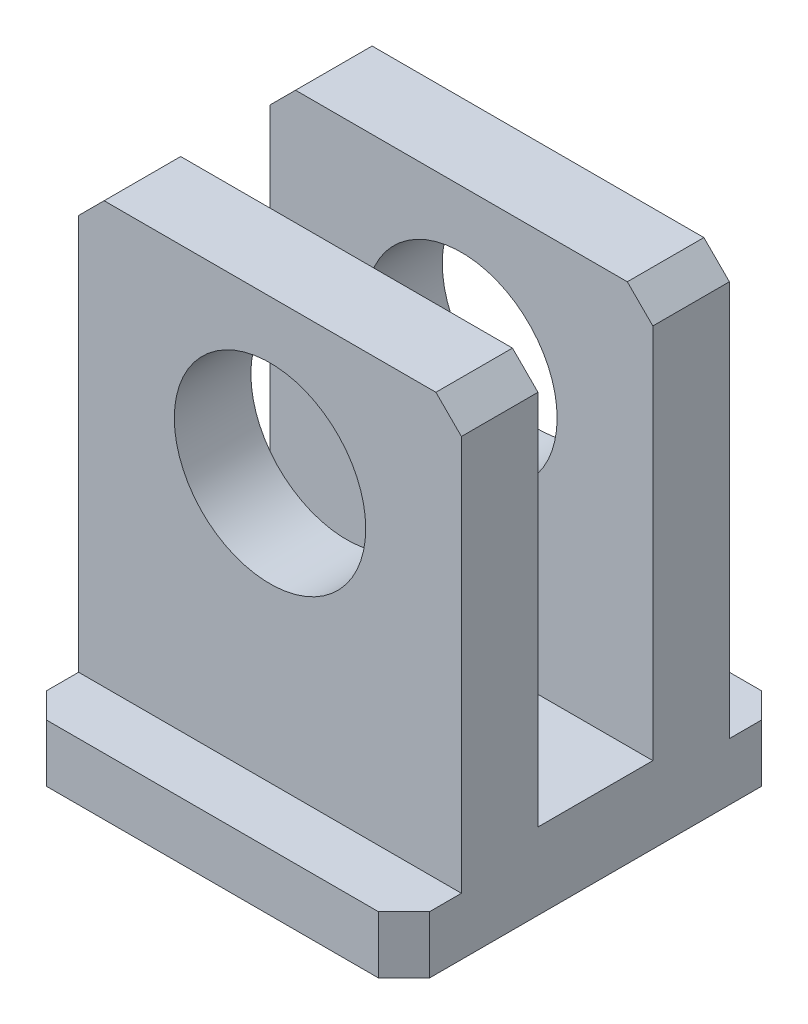
ISO-10303-21;
HEADER;
FILE_DESCRIPTION(('STEP AP214'),'2;1');
FILE_NAME('part.step','',(''),(''),'','','');
FILE_SCHEMA(('AUTOMOTIVE_DESIGN { 1 0 10303 214 1 1 1 1 }'));
ENDSEC;
DATA;
#1=APPLICATION_CONTEXT('core data for automotive mechanical design processes');
#2=APPLICATION_PROTOCOL_DEFINITION('international standard','automotive_design',2000,#1);
#3=PRODUCT_CONTEXT('',#1,'mechanical');
#4=PRODUCT('Part','Part','',(#3));
#5=PRODUCT_RELATED_PRODUCT_CATEGORY('part','',(#4));
#6=PRODUCT_DEFINITION_FORMATION('','',#4);
#7=PRODUCT_DEFINITION_CONTEXT('part definition',#1,'design');
#8=PRODUCT_DEFINITION('design','',#6,#7);
#9=PRODUCT_DEFINITION_SHAPE('','',#8);
#10=(LENGTH_UNIT() NAMED_UNIT(*) SI_UNIT(.MILLI.,.METRE.));
#11=(NAMED_UNIT(*) PLANE_ANGLE_UNIT() SI_UNIT($,.RADIAN.));
#12=(NAMED_UNIT(*) SI_UNIT($,.STERADIAN.) SOLID_ANGLE_UNIT());
#13=UNCERTAINTY_MEASURE_WITH_UNIT(LENGTH_MEASURE(1.E-05),#10,'distance_accuracy_value','');
#14=(GEOMETRIC_REPRESENTATION_CONTEXT(3) GLOBAL_UNCERTAINTY_ASSIGNED_CONTEXT((#13)) GLOBAL_UNIT_ASSIGNED_CONTEXT((#10,
#11,#12)) REPRESENTATION_CONTEXT('',''));
#15=CARTESIAN_POINT('',(0.,0.,0.));
#16=DIRECTION('',(0.,0.,1.));
#17=DIRECTION('',(1.,0.,0.));
#18=AXIS2_PLACEMENT_3D('',#15,#16,#17);
#19=CARTESIAN_POINT('',(0.,0.,0.));
#20=DIRECTION('',(0.,0.,1.));
#21=DIRECTION('',(1.,0.,0.));
#22=AXIS2_PLACEMENT_3D('',#19,#20,#21);
#23=PLANE('',#22);
#24=CARTESIAN_POINT('',(0.,6.75,0.));
#25=DIRECTION('',(0.,0.,1.));
#26=DIRECTION('',(1.,0.,0.));
#27=AXIS2_PLACEMENT_3D('',#24,#25,#26);
#28=CIRCLE('',#27,7.5);
#29=CARTESIAN_POINT('',(7.5,6.75,0.));
#30=VERTEX_POINT('',#29);
#31=EDGE_CURVE('E281',#30,#30,#28,.F.);
#32=ORIENTED_EDGE('',*,*,#31,.F.);
#33=EDGE_LOOP('',(#32));
#34=FACE_BOUND('',#33,.T.);
#35=DIRECTION('',(1.,0.,0.));
#36=VECTOR('',#35,1.);
#37=CARTESIAN_POINT('',(15.,-12.75,0.));
#38=LINE('',#37,#36);
#39=CARTESIAN_POINT('',(-15.,-12.75,0.));
#40=VERTEX_POINT('',#39);
#41=CARTESIAN_POINT('',(15.,-12.75,0.));
#42=VERTEX_POINT('',#41);
#43=EDGE_CURVE('E61',#40,#42,#38,.T.);
#44=ORIENTED_EDGE('',*,*,#43,.F.);
#45=DIRECTION('',(0.,-1.,0.));
#46=VECTOR('',#45,1.);
#47=CARTESIAN_POINT('',(-15.,-18.75,0.));
#48=LINE('',#47,#46);
#49=CARTESIAN_POINT('',(-15.,16.75,0.));
#50=VERTEX_POINT('',#49);
#51=EDGE_CURVE('E301',#50,#40,#48,.T.);
#52=ORIENTED_EDGE('',*,*,#51,.F.);
#53=DIRECTION('',(-0.707106781186547,-0.707106781186548,0.));
#54=VECTOR('',#53,1.);
#55=CARTESIAN_POINT('',(-13.,18.75,0.));
#56=LINE('',#55,#54);
#57=CARTESIAN_POINT('',(-13.,18.75,0.));
#58=VERTEX_POINT('',#57);
#59=EDGE_CURVE('E316',#58,#50,#56,.T.);
#60=ORIENTED_EDGE('',*,*,#59,.F.);
#61=DIRECTION('',(-1.,0.,0.));
#62=VECTOR('',#61,1.);
#63=CARTESIAN_POINT('',(13.,18.75,0.));
#64=LINE('',#63,#62);
#65=CARTESIAN_POINT('',(13.,18.75,0.));
#66=VERTEX_POINT('',#65);
#67=EDGE_CURVE('E314',#66,#58,#64,.T.);
#68=ORIENTED_EDGE('',*,*,#67,.F.);
#69=DIRECTION('',(-0.707106781186547,0.707106781186548,0.));
#70=VECTOR('',#69,1.);
#71=CARTESIAN_POINT('',(15.,16.75,0.));
#72=LINE('',#71,#70);
#73=CARTESIAN_POINT('',(15.,16.75,0.));
#74=VERTEX_POINT('',#73);
#75=EDGE_CURVE('E312',#74,#66,#72,.T.);
#76=ORIENTED_EDGE('',*,*,#75,.F.);
#77=DIRECTION('',(0.,1.,0.));
#78=VECTOR('',#77,1.);
#79=CARTESIAN_POINT('',(15.,-18.75,0.));
#80=LINE('',#79,#78);
#81=EDGE_CURVE('E297',#42,#74,#80,.T.);
#82=ORIENTED_EDGE('',*,*,#81,.F.);
#83=EDGE_LOOP('',(#44,#52,#60,#68,#76,#82));
#84=FACE_BOUND('',#83,.T.);
#85=ADVANCED_FACE('F45',(#34,#84),#23,.F.);
#86=CARTESIAN_POINT('',(0.,0.,6.));
#87=DIRECTION('',(0.,0.,1.));
#88=DIRECTION('',(1.,0.,0.));
#89=AXIS2_PLACEMENT_3D('',#86,#87,#88);
#90=PLANE('',#89);
#91=CARTESIAN_POINT('',(0.,6.75,6.));
#92=DIRECTION('',(0.,0.,1.));
#93=DIRECTION('',(1.,0.,0.));
#94=AXIS2_PLACEMENT_3D('',#91,#92,#93);
#95=CIRCLE('',#94,7.5);
#96=CARTESIAN_POINT('',(7.5,6.75,6.));
#97=VERTEX_POINT('',#96);
#98=EDGE_CURVE('E278',#97,#97,#95,.T.);
#99=ORIENTED_EDGE('',*,*,#98,.F.);
#100=EDGE_LOOP('',(#99));
#101=FACE_BOUND('',#100,.T.);
#102=DIRECTION('',(0.,-1.,0.));
#103=VECTOR('',#102,1.);
#104=CARTESIAN_POINT('',(-15.,-18.75,6.));
#105=LINE('',#104,#103);
#106=CARTESIAN_POINT('',(-15.,16.75,6.));
#107=VERTEX_POINT('',#106);
#108=CARTESIAN_POINT('',(-15.,-14.25,6.));
#109=VERTEX_POINT('',#108);
#110=EDGE_CURVE('E307',#107,#109,#105,.T.);
#111=ORIENTED_EDGE('',*,*,#110,.T.);
#112=DIRECTION('',(1.,0.,0.));
#113=VECTOR('',#112,1.);
#114=CARTESIAN_POINT('',(0.,-14.25,6.));
#115=LINE('',#114,#113);
#116=CARTESIAN_POINT('',(15.,-14.25,6.));
#117=VERTEX_POINT('',#116);
#118=EDGE_CURVE('E284',#109,#117,#115,.T.);
#119=ORIENTED_EDGE('',*,*,#118,.T.);
#120=DIRECTION('',(0.,1.,0.));
#121=VECTOR('',#120,1.);
#122=CARTESIAN_POINT('',(15.,-18.75,6.));
#123=LINE('',#122,#121);
#124=CARTESIAN_POINT('',(15.,16.75,6.));
#125=VERTEX_POINT('',#124);
#126=EDGE_CURVE('E298',#117,#125,#123,.T.);
#127=ORIENTED_EDGE('',*,*,#126,.T.);
#128=DIRECTION('',(-0.707106781186547,0.707106781186548,0.));
#129=VECTOR('',#128,1.);
#130=CARTESIAN_POINT('',(15.,16.75,6.));
#131=LINE('',#130,#129);
#132=CARTESIAN_POINT('',(13.,18.75,6.));
#133=VERTEX_POINT('',#132);
#134=EDGE_CURVE('E300',#125,#133,#131,.T.);
#135=ORIENTED_EDGE('',*,*,#134,.T.);
#136=DIRECTION('',(-1.,0.,0.));
#137=VECTOR('',#136,1.);
#138=CARTESIAN_POINT('',(13.,18.75,6.));
#139=LINE('',#138,#137);
#140=CARTESIAN_POINT('',(-13.,18.75,6.));
#141=VERTEX_POINT('',#140);
#142=EDGE_CURVE('E303',#133,#141,#139,.T.);
#143=ORIENTED_EDGE('',*,*,#142,.T.);
#144=DIRECTION('',(-0.707106781186547,-0.707106781186548,0.));
#145=VECTOR('',#144,1.);
#146=CARTESIAN_POINT('',(-13.,18.75,6.));
#147=LINE('',#146,#145);
#148=EDGE_CURVE('E305',#141,#107,#147,.T.);
#149=ORIENTED_EDGE('',*,*,#148,.T.);
#150=EDGE_LOOP('',(#111,#119,#127,#135,#143,#149));
#151=FACE_BOUND('',#150,.T.);
#152=ADVANCED_FACE('F420',(#101,#151),#90,.T.);
#153=CARTESIAN_POINT('',(15.,-18.75,6.));
#154=DIRECTION('',(-1.,0.,0.));
#155=DIRECTION('',(0.,0.,1.));
#156=AXIS2_PLACEMENT_3D('',#153,#154,#155);
#157=PLANE('',#156);
#158=DIRECTION('',(0.,0.,-1.));
#159=VECTOR('',#158,1.);
#160=CARTESIAN_POINT('',(15.,-14.25,10.5));
#161=LINE('',#160,#159);
#162=CARTESIAN_POINT('',(15.,-14.25,8.5));
#163=VERTEX_POINT('',#162);
#164=EDGE_CURVE('E291',#163,#117,#161,.T.);
#165=ORIENTED_EDGE('',*,*,#164,.F.);
#166=DIRECTION('',(0.,-1.,0.));
#167=VECTOR('',#166,1.);
#168=CARTESIAN_POINT('',(15.,-18.75,8.5));
#169=LINE('',#168,#167);
#170=CARTESIAN_POINT('',(15.,-18.75,8.5));
#171=VERTEX_POINT('',#170);
#172=EDGE_CURVE('E54',#163,#171,#169,.T.);
#173=ORIENTED_EDGE('',*,*,#172,.T.);
#174=DIRECTION('',(0.,0.,-1.));
#175=VECTOR('',#174,1.);
#176=CARTESIAN_POINT('',(15.,-18.75,6.));
#177=LINE('',#176,#175);
#178=CARTESIAN_POINT('',(15.,-18.75,-17.5));
#179=VERTEX_POINT('',#178);
#180=EDGE_CURVE('E310',#171,#179,#177,.T.);
#181=ORIENTED_EDGE('',*,*,#180,.T.);
#182=DIRECTION('',(0.,-1.,0.));
#183=VECTOR('',#182,1.);
#184=CARTESIAN_POINT('',(15.,-18.75,-17.5));
#185=LINE('',#184,#183);
#186=CARTESIAN_POINT('',(15.,-14.25,-17.5));
#187=VERTEX_POINT('',#186);
#188=EDGE_CURVE('E270',#187,#179,#185,.T.);
#189=ORIENTED_EDGE('',*,*,#188,.F.);
#190=DIRECTION('',(0.,0.,1.));
#191=VECTOR('',#190,1.);
#192=CARTESIAN_POINT('',(15.,-14.25,-19.5));
#193=LINE('',#192,#191);
#194=CARTESIAN_POINT('',(15.,-14.25,-15.));
#195=VERTEX_POINT('',#194);
#196=EDGE_CURVE('E222',#187,#195,#193,.T.);
#197=ORIENTED_EDGE('',*,*,#196,.T.);
#198=DIRECTION('',(0.,1.,0.));
#199=VECTOR('',#198,1.);
#200=CARTESIAN_POINT('',(15.,-18.75,-15.));
#201=LINE('',#200,#199);
#202=CARTESIAN_POINT('',(15.,16.75,-15.));
#203=VERTEX_POINT('',#202);
#204=EDGE_CURVE('E227',#195,#203,#201,.T.);
#205=ORIENTED_EDGE('',*,*,#204,.T.);
#206=DIRECTION('',(0.,0.,1.));
#207=VECTOR('',#206,1.);
#208=CARTESIAN_POINT('',(15.,16.75,-15.));
#209=LINE('',#208,#207);
#210=CARTESIAN_POINT('',(15.,16.75,-9.));
#211=VERTEX_POINT('',#210);
#212=EDGE_CURVE('E195',#203,#211,#209,.T.);
#213=ORIENTED_EDGE('',*,*,#212,.T.);
#214=DIRECTION('',(0.,1.,0.));
#215=VECTOR('',#214,1.);
#216=CARTESIAN_POINT('',(15.,-18.75,-9.));
#217=LINE('',#216,#215);
#218=CARTESIAN_POINT('',(15.,-12.75,-9.));
#219=VERTEX_POINT('',#218);
#220=EDGE_CURVE('E192',#219,#211,#217,.T.);
#221=ORIENTED_EDGE('',*,*,#220,.F.);
#222=DIRECTION('',(0.,0.,1.));
#223=VECTOR('',#222,1.);
#224=CARTESIAN_POINT('',(15.,-12.75,-4.5));
#225=LINE('',#224,#223);
#226=EDGE_CURVE('E183',#219,#42,#225,.T.);
#227=ORIENTED_EDGE('',*,*,#226,.T.);
#228=ORIENTED_EDGE('',*,*,#81,.T.);
#229=DIRECTION('',(0.,0.,-1.));
#230=VECTOR('',#229,1.);
#231=CARTESIAN_POINT('',(15.,16.75,6.));
#232=LINE('',#231,#230);
#233=EDGE_CURVE('E331',#125,#74,#232,.T.);
#234=ORIENTED_EDGE('',*,*,#233,.F.);
#235=ORIENTED_EDGE('',*,*,#126,.F.);
#236=EDGE_LOOP('',(#165,#173,#181,#189,#197,#205,#213,#221,#227,#228,#234,#235));
#237=FACE_BOUND('',#236,.T.);
#238=ADVANCED_FACE('F193',(#237),#157,.F.);
#239=CARTESIAN_POINT('',(15.,16.75,6.));
#240=DIRECTION('',(-0.707106781186548,-0.707106781186547,0.));
#241=DIRECTION('',(0.707106781186547,-0.707106781186548,0.));
#242=AXIS2_PLACEMENT_3D('',#239,#240,#241);
#243=PLANE('',#242);
#244=ORIENTED_EDGE('',*,*,#75,.T.);
#245=DIRECTION('',(0.,0.,-1.));
#246=VECTOR('',#245,1.);
#247=CARTESIAN_POINT('',(13.,18.75,6.));
#248=LINE('',#247,#246);
#249=EDGE_CURVE('E328',#133,#66,#248,.T.);
#250=ORIENTED_EDGE('',*,*,#249,.F.);
#251=ORIENTED_EDGE('',*,*,#134,.F.);
#252=ORIENTED_EDGE('',*,*,#233,.T.);
#253=EDGE_LOOP('',(#244,#250,#251,#252));
#254=FACE_BOUND('',#253,.T.);
#255=ADVANCED_FACE('F418',(#254),#243,.F.);
#256=CARTESIAN_POINT('',(13.,18.75,6.));
#257=DIRECTION('',(0.,-1.,0.));
#258=DIRECTION('',(1.,0.,0.));
#259=AXIS2_PLACEMENT_3D('',#256,#257,#258);
#260=PLANE('',#259);
#261=ORIENTED_EDGE('',*,*,#67,.T.);
#262=DIRECTION('',(0.,0.,-1.));
#263=VECTOR('',#262,1.);
#264=CARTESIAN_POINT('',(-13.,18.75,6.));
#265=LINE('',#264,#263);
#266=EDGE_CURVE('E325',#141,#58,#265,.T.);
#267=ORIENTED_EDGE('',*,*,#266,.F.);
#268=ORIENTED_EDGE('',*,*,#142,.F.);
#269=ORIENTED_EDGE('',*,*,#249,.T.);
#270=EDGE_LOOP('',(#261,#267,#268,#269));
#271=FACE_BOUND('',#270,.T.);
#272=ADVANCED_FACE('F414',(#271),#260,.F.);
#273=CARTESIAN_POINT('',(-13.,18.75,6.));
#274=DIRECTION('',(0.707106781186548,-0.707106781186547,0.));
#275=DIRECTION('',(0.707106781186547,0.707106781186548,0.));
#276=AXIS2_PLACEMENT_3D('',#273,#274,#275);
#277=PLANE('',#276);
#278=ORIENTED_EDGE('',*,*,#59,.T.);
#279=DIRECTION('',(0.,0.,-1.));
#280=VECTOR('',#279,1.);
#281=CARTESIAN_POINT('',(-15.,16.75,6.));
#282=LINE('',#281,#280);
#283=EDGE_CURVE('E322',#107,#50,#282,.T.);
#284=ORIENTED_EDGE('',*,*,#283,.F.);
#285=ORIENTED_EDGE('',*,*,#148,.F.);
#286=ORIENTED_EDGE('',*,*,#266,.T.);
#287=EDGE_LOOP('',(#278,#284,#285,#286));
#288=FACE_BOUND('',#287,.T.);
#289=ADVANCED_FACE('F409',(#288),#277,.F.);
#290=CARTESIAN_POINT('',(-15.,-18.75,6.));
#291=DIRECTION('',(1.,0.,0.));
#292=DIRECTION('',(0.,0.,-1.));
#293=AXIS2_PLACEMENT_3D('',#290,#291,#292);
#294=PLANE('',#293);
#295=DIRECTION('',(0.,0.,-1.));
#296=VECTOR('',#295,1.);
#297=CARTESIAN_POINT('',(-15.,-18.75,6.));
#298=LINE('',#297,#296);
#299=CARTESIAN_POINT('',(-15.,-18.75,8.5));
#300=VERTEX_POINT('',#299);
#301=CARTESIAN_POINT('',(-15.,-18.75,-17.5));
#302=VERTEX_POINT('',#301);
#303=EDGE_CURVE('E320',#300,#302,#298,.T.);
#304=ORIENTED_EDGE('',*,*,#303,.F.);
#305=DIRECTION('',(0.,1.,0.));
#306=VECTOR('',#305,1.);
#307=CARTESIAN_POINT('',(-15.,-14.25,8.5));
#308=LINE('',#307,#306);
#309=CARTESIAN_POINT('',(-15.,-14.25,8.5));
#310=VERTEX_POINT('',#309);
#311=EDGE_CURVE('E339',#300,#310,#308,.T.);
#312=ORIENTED_EDGE('',*,*,#311,.T.);
#313=DIRECTION('',(0.,0.,-1.));
#314=VECTOR('',#313,1.);
#315=CARTESIAN_POINT('',(-15.,-14.25,10.5));
#316=LINE('',#315,#314);
#317=EDGE_CURVE('E295',#310,#109,#316,.T.);
#318=ORIENTED_EDGE('',*,*,#317,.T.);
#319=ORIENTED_EDGE('',*,*,#110,.F.);
#320=ORIENTED_EDGE('',*,*,#283,.T.);
#321=ORIENTED_EDGE('',*,*,#51,.T.);
#322=DIRECTION('',(0.,0.,1.));
#323=VECTOR('',#322,1.);
#324=CARTESIAN_POINT('',(-15.,-12.75,-4.5));
#325=LINE('',#324,#323);
#326=CARTESIAN_POINT('',(-15.,-12.75,-9.));
#327=VERTEX_POINT('',#326);
#328=EDGE_CURVE('E189',#327,#40,#325,.T.);
#329=ORIENTED_EDGE('',*,*,#328,.F.);
#330=DIRECTION('',(0.,-1.,0.));
#331=VECTOR('',#330,1.);
#332=CARTESIAN_POINT('',(-15.,-18.75,-9.));
#333=LINE('',#332,#331);
#334=CARTESIAN_POINT('',(-15.,16.75,-9.));
#335=VERTEX_POINT('',#334);
#336=EDGE_CURVE('E206',#335,#327,#333,.T.);
#337=ORIENTED_EDGE('',*,*,#336,.F.);
#338=DIRECTION('',(0.,0.,1.));
#339=VECTOR('',#338,1.);
#340=CARTESIAN_POINT('',(-15.,16.75,-15.));
#341=LINE('',#340,#339);
#342=CARTESIAN_POINT('',(-15.,16.75,-15.));
#343=VERTEX_POINT('',#342);
#344=EDGE_CURVE('E240',#343,#335,#341,.T.);
#345=ORIENTED_EDGE('',*,*,#344,.F.);
#346=DIRECTION('',(0.,-1.,0.));
#347=VECTOR('',#346,1.);
#348=CARTESIAN_POINT('',(-15.,-18.75,-15.));
#349=LINE('',#348,#347);
#350=CARTESIAN_POINT('',(-15.,-14.25,-15.));
#351=VERTEX_POINT('',#350);
#352=EDGE_CURVE('E238',#343,#351,#349,.T.);
#353=ORIENTED_EDGE('',*,*,#352,.T.);
#354=DIRECTION('',(0.,0.,1.));
#355=VECTOR('',#354,1.);
#356=CARTESIAN_POINT('',(-15.,-14.25,-19.5));
#357=LINE('',#356,#355);
#358=CARTESIAN_POINT('',(-15.,-14.25,-17.5));
#359=VERTEX_POINT('',#358);
#360=EDGE_CURVE('E200',#359,#351,#357,.T.);
#361=ORIENTED_EDGE('',*,*,#360,.F.);
#362=DIRECTION('',(0.,1.,0.));
#363=VECTOR('',#362,1.);
#364=CARTESIAN_POINT('',(-15.,-14.25,-17.5));
#365=LINE('',#364,#363);
#366=EDGE_CURVE('E260',#302,#359,#365,.T.);
#367=ORIENTED_EDGE('',*,*,#366,.F.);
#368=EDGE_LOOP('',(#304,#312,#318,#319,#320,#321,#329,#337,#345,#353,#361,#367));
#369=FACE_BOUND('',#368,.T.);
#370=ADVANCED_FACE('F371',(#369),#294,.F.);
#371=CARTESIAN_POINT('',(15.,-18.75,6.));
#372=DIRECTION('',(0.,1.,0.));
#373=DIRECTION('',(-1.,0.,0.));
#374=AXIS2_PLACEMENT_3D('',#371,#372,#373);
#375=PLANE('',#374);
#376=ORIENTED_EDGE('',*,*,#180,.F.);
#377=DIRECTION('',(-0.707106781186546,0.,0.707106781186549));
#378=VECTOR('',#377,1.);
#379=CARTESIAN_POINT('',(13.,-18.75,10.5));
#380=LINE('',#379,#378);
#381=CARTESIAN_POINT('',(13.,-18.75,10.5));
#382=VERTEX_POINT('',#381);
#383=EDGE_CURVE('E11',#171,#382,#380,.T.);
#384=ORIENTED_EDGE('',*,*,#383,.T.);
#385=DIRECTION('',(1.,0.,0.));
#386=VECTOR('',#385,1.);
#387=CARTESIAN_POINT('',(0.,-18.75,10.5));
#388=LINE('',#387,#386);
#389=CARTESIAN_POINT('',(-13.,-18.75,10.5));
#390=VERTEX_POINT('',#389);
#391=EDGE_CURVE('E288',#390,#382,#388,.T.);
#392=ORIENTED_EDGE('',*,*,#391,.F.);
#393=DIRECTION('',(-0.707106781186546,0.,-0.707106781186549));
#394=VECTOR('',#393,1.);
#395=CARTESIAN_POINT('',(-13.,-18.75,10.5));
#396=LINE('',#395,#394);
#397=EDGE_CURVE('E337',#390,#300,#396,.T.);
#398=ORIENTED_EDGE('',*,*,#397,.T.);
#399=ORIENTED_EDGE('',*,*,#303,.T.);
#400=DIRECTION('',(-0.707106781186546,0.,0.707106781186549));
#401=VECTOR('',#400,1.);
#402=CARTESIAN_POINT('',(-13.,-18.75,-19.5));
#403=LINE('',#402,#401);
#404=CARTESIAN_POINT('',(-13.,-18.75,-19.5));
#405=VERTEX_POINT('',#404);
#406=EDGE_CURVE('E257',#405,#302,#403,.T.);
#407=ORIENTED_EDGE('',*,*,#406,.F.);
#408=DIRECTION('',(1.,0.,0.));
#409=VECTOR('',#408,1.);
#410=CARTESIAN_POINT('',(0.,-18.75,-19.5));
#411=LINE('',#410,#409);
#412=CARTESIAN_POINT('',(13.,-18.75,-19.5));
#413=VERTEX_POINT('',#412);
#414=EDGE_CURVE('E219',#405,#413,#411,.T.);
#415=ORIENTED_EDGE('',*,*,#414,.T.);
#416=DIRECTION('',(-0.707106781186546,0.,-0.707106781186549));
#417=VECTOR('',#416,1.);
#418=CARTESIAN_POINT('',(13.,-18.75,-19.5));
#419=LINE('',#418,#417);
#420=EDGE_CURVE('E273',#179,#413,#419,.T.);
#421=ORIENTED_EDGE('',*,*,#420,.F.);
#422=EDGE_LOOP('',(#376,#384,#392,#398,#399,#407,#415,#421));
#423=FACE_BOUND('',#422,.T.);
#424=ADVANCED_FACE('F358',(#423),#375,.F.);
#425=CARTESIAN_POINT('',(0.,-14.25,10.5));
#426=DIRECTION('',(0.,1.,0.));
#427=DIRECTION('',(0.,0.,1.));
#428=AXIS2_PLACEMENT_3D('',#425,#426,#427);
#429=PLANE('',#428);
#430=DIRECTION('',(1.,0.,0.));
#431=VECTOR('',#430,1.);
#432=CARTESIAN_POINT('',(0.,-14.25,10.5));
#433=LINE('',#432,#431);
#434=CARTESIAN_POINT('',(-13.,-14.25,10.5));
#435=VERTEX_POINT('',#434);
#436=CARTESIAN_POINT('',(13.,-14.25,10.5));
#437=VERTEX_POINT('',#436);
#438=EDGE_CURVE('E285',#435,#437,#433,.T.);
#439=ORIENTED_EDGE('',*,*,#438,.T.);
#440=DIRECTION('',(0.707106781186546,0.,-0.707106781186549));
#441=VECTOR('',#440,1.);
#442=CARTESIAN_POINT('',(6.50000000000002,-14.25,17.));
#443=LINE('',#442,#441);
#444=EDGE_CURVE('E346',#437,#163,#443,.T.);
#445=ORIENTED_EDGE('',*,*,#444,.T.);
#446=ORIENTED_EDGE('',*,*,#164,.T.);
#447=ORIENTED_EDGE('',*,*,#118,.F.);
#448=ORIENTED_EDGE('',*,*,#317,.F.);
#449=DIRECTION('',(0.707106781186546,0.,0.707106781186549));
#450=VECTOR('',#449,1.);
#451=CARTESIAN_POINT('',(-6.50000000000003,-14.25,17.));
#452=LINE('',#451,#450);
#453=EDGE_CURVE('E341',#310,#435,#452,.T.);
#454=ORIENTED_EDGE('',*,*,#453,.T.);
#455=EDGE_LOOP('',(#439,#445,#446,#447,#448,#454));
#456=FACE_BOUND('',#455,.T.);
#457=ADVANCED_FACE('F348',(#456),#429,.T.);
#458=CARTESIAN_POINT('',(0.,0.,10.5));
#459=DIRECTION('',(0.,0.,1.));
#460=DIRECTION('',(1.,0.,0.));
#461=AXIS2_PLACEMENT_3D('',#458,#459,#460);
#462=PLANE('',#461);
#463=ORIENTED_EDGE('',*,*,#391,.T.);
#464=DIRECTION('',(0.,1.,0.));
#465=VECTOR('',#464,1.);
#466=CARTESIAN_POINT('',(13.,-14.25,10.5));
#467=LINE('',#466,#465);
#468=EDGE_CURVE('E343',#382,#437,#467,.T.);
#469=ORIENTED_EDGE('',*,*,#468,.T.);
#470=ORIENTED_EDGE('',*,*,#438,.F.);
#471=DIRECTION('',(0.,-1.,0.));
#472=VECTOR('',#471,1.);
#473=CARTESIAN_POINT('',(-13.,-18.75,10.5));
#474=LINE('',#473,#472);
#475=EDGE_CURVE('E334',#435,#390,#474,.T.);
#476=ORIENTED_EDGE('',*,*,#475,.T.);
#477=EDGE_LOOP('',(#463,#469,#470,#476));
#478=FACE_BOUND('',#477,.T.);
#479=ADVANCED_FACE('F361',(#478),#462,.T.);
#480=CARTESIAN_POINT('',(-13.,0.,10.5));
#481=DIRECTION('',(-0.707106781186549,0.,0.707106781186546));
#482=DIRECTION('',(0.,1.,0.));
#483=AXIS2_PLACEMENT_3D('',#480,#481,#482);
#484=PLANE('',#483);
#485=ORIENTED_EDGE('',*,*,#453,.F.);
#486=ORIENTED_EDGE('',*,*,#311,.F.);
#487=ORIENTED_EDGE('',*,*,#397,.F.);
#488=ORIENTED_EDGE('',*,*,#475,.F.);
#489=EDGE_LOOP('',(#485,#486,#487,#488));
#490=FACE_BOUND('',#489,.T.);
#491=ADVANCED_FACE('F365',(#490),#484,.T.);
#492=CARTESIAN_POINT('',(13.,0.,10.5));
#493=DIRECTION('',(0.707106781186549,0.,0.707106781186546));
#494=DIRECTION('',(0.,-1.,0.));
#495=AXIS2_PLACEMENT_3D('',#492,#493,#494);
#496=PLANE('',#495);
#497=ORIENTED_EDGE('',*,*,#383,.F.);
#498=ORIENTED_EDGE('',*,*,#172,.F.);
#499=ORIENTED_EDGE('',*,*,#444,.F.);
#500=ORIENTED_EDGE('',*,*,#468,.F.);
#501=EDGE_LOOP('',(#497,#498,#499,#500));
#502=FACE_BOUND('',#501,.T.);
#503=ADVANCED_FACE('F48',(#502),#496,.T.);
#504=CARTESIAN_POINT('',(0.,6.75,-0.00100000000000013));
#505=DIRECTION('',(0.,0.,1.));
#506=DIRECTION('',(1.,0.,0.));
#507=AXIS2_PLACEMENT_3D('',#504,#505,#506);
#508=CYLINDRICAL_SURFACE('',#507,7.5);
#509=CARTESIAN_POINT('',(7.5,6.75,6.));
#510=CARTESIAN_POINT('',(7.5,6.75,5.9375));
#511=CARTESIAN_POINT('',(7.5,6.75,5.875));
#512=CARTESIAN_POINT('',(7.5,6.75,5.75));
#513=CARTESIAN_POINT('',(7.5,6.75,5.6875));
#514=CARTESIAN_POINT('',(7.5,6.75,5.5625));
#515=CARTESIAN_POINT('',(7.5,6.75,5.5));
#516=CARTESIAN_POINT('',(7.5,6.75,5.375));
#517=CARTESIAN_POINT('',(7.5,6.75,5.3125));
#518=CARTESIAN_POINT('',(7.5,6.75,5.1875));
#519=CARTESIAN_POINT('',(7.5,6.75,5.125));
#520=CARTESIAN_POINT('',(7.5,6.75,5.));
#521=CARTESIAN_POINT('',(7.5,6.75,4.9375));
#522=CARTESIAN_POINT('',(7.5,6.75,4.8125));
#523=CARTESIAN_POINT('',(7.5,6.75,4.75));
#524=CARTESIAN_POINT('',(7.5,6.75,4.625));
#525=CARTESIAN_POINT('',(7.5,6.75,4.5625));
#526=CARTESIAN_POINT('',(7.5,6.75,4.4375));
#527=CARTESIAN_POINT('',(7.5,6.75,4.375));
#528=CARTESIAN_POINT('',(7.5,6.75,4.25));
#529=CARTESIAN_POINT('',(7.5,6.75,4.1875));
#530=CARTESIAN_POINT('',(7.5,6.75,4.0625));
#531=CARTESIAN_POINT('',(7.5,6.75,4.));
#532=CARTESIAN_POINT('',(7.5,6.75,3.875));
#533=CARTESIAN_POINT('',(7.5,6.75,3.8125));
#534=CARTESIAN_POINT('',(7.5,6.75,3.6875));
#535=CARTESIAN_POINT('',(7.5,6.75,3.625));
#536=CARTESIAN_POINT('',(7.5,6.75,3.5));
#537=CARTESIAN_POINT('',(7.5,6.75,3.4375));
#538=CARTESIAN_POINT('',(7.5,6.75,3.3125));
#539=CARTESIAN_POINT('',(7.5,6.75,3.25));
#540=CARTESIAN_POINT('',(7.5,6.75,3.125));
#541=CARTESIAN_POINT('',(7.5,6.75,3.0625));
#542=CARTESIAN_POINT('',(7.5,6.75,2.9375));
#543=CARTESIAN_POINT('',(7.5,6.75,2.875));
#544=CARTESIAN_POINT('',(7.5,6.75,2.75));
#545=CARTESIAN_POINT('',(7.5,6.75,2.6875));
#546=CARTESIAN_POINT('',(7.5,6.75,2.5625));
#547=CARTESIAN_POINT('',(7.5,6.75,2.5));
#548=CARTESIAN_POINT('',(7.5,6.75,2.375));
#549=CARTESIAN_POINT('',(7.5,6.75,2.3125));
#550=CARTESIAN_POINT('',(7.5,6.75,2.1875));
#551=CARTESIAN_POINT('',(7.5,6.75,2.125));
#552=CARTESIAN_POINT('',(7.5,6.75,2.));
#553=CARTESIAN_POINT('',(7.5,6.75,1.9375));
#554=CARTESIAN_POINT('',(7.5,6.75,1.8125));
#555=CARTESIAN_POINT('',(7.5,6.75,1.75));
#556=CARTESIAN_POINT('',(7.5,6.75,1.625));
#557=CARTESIAN_POINT('',(7.5,6.75,1.5625));
#558=CARTESIAN_POINT('',(7.5,6.75,1.4375));
#559=CARTESIAN_POINT('',(7.5,6.75,1.375));
#560=CARTESIAN_POINT('',(7.5,6.75,1.25));
#561=CARTESIAN_POINT('',(7.5,6.75,1.1875));
#562=CARTESIAN_POINT('',(7.5,6.75,1.0625));
#563=CARTESIAN_POINT('',(7.5,6.75,1.));
#564=CARTESIAN_POINT('',(7.5,6.75,0.875));
#565=CARTESIAN_POINT('',(7.5,6.75,0.8125));
#566=CARTESIAN_POINT('',(7.5,6.75,0.6875));
#567=CARTESIAN_POINT('',(7.5,6.75,0.625));
#568=CARTESIAN_POINT('',(7.5,6.75,0.5));
#569=CARTESIAN_POINT('',(7.5,6.75,0.4375));
#570=CARTESIAN_POINT('',(7.5,6.75,0.3125));
#571=CARTESIAN_POINT('',(7.5,6.75,0.25));
#572=CARTESIAN_POINT('',(7.5,6.75,0.125));
#573=CARTESIAN_POINT('',(7.5,6.75,0.0625000000000001));
#574=CARTESIAN_POINT('',(7.5,6.75,0.));
#575=B_SPLINE_CURVE_WITH_KNOTS('',3,(#509,#510,#511,#512,#513,#514,#515,#516,#517,#518,#519,
#520,#521,#522,#523,#524,#525,#526,#527,#528,#529,#530,#531,#532,#533,#534,#535,#536,#537,#538,
#539,#540,#541,#542,#543,#544,#545,#546,#547,#548,#549,#550,#551,#552,#553,#554,#555,#556,#557,
#558,#559,#560,#561,#562,#563,#564,#565,#566,#567,#568,#569,#570,#571,#572,#573,#574),
.UNSPECIFIED.,.F.,.F.,(4,2,2,2,2,2,2,2,2,2,2,2,2,2,2,2,2,2,2,2,2,2,2,2,2,2,2,2,2,2,2,2,4),(0.,
0.1875,0.375,0.5625,0.75,0.9375,1.125,1.3125,1.5,1.6875,1.875,2.0625,2.25,2.4375,2.625,2.8125,
3.,3.1875,3.375,3.5625,3.75,3.9375,4.125,4.3125,4.5,4.6875,4.875,5.0625,5.25,5.4375,5.625,
5.8125,6.),.UNSPECIFIED.);
#576=EDGE_CURVE('BSEAM453',#97,#30,#575,.T.);
#577=ORIENTED_EDGE('',*,*,#98,.T.);
#578=ORIENTED_EDGE('',*,*,#31,.T.);
#579=ORIENTED_EDGE('',*,*,#576,.T.);
#580=ORIENTED_EDGE('',*,*,#576,.F.);
#581=EDGE_LOOP('',(#577,#579,#578,#580));
#582=FACE_BOUND('',#581,.T.);
#583=ADVANCED_FACE('F453',(#582),#508,.F.);
#584=CARTESIAN_POINT('',(15.,-12.75,-4.5));
#585=DIRECTION('',(0.,-1.,0.));
#586=DIRECTION('',(1.,0.,0.));
#587=AXIS2_PLACEMENT_3D('',#584,#585,#586);
#588=PLANE('',#587);
#589=ORIENTED_EDGE('',*,*,#43,.T.);
#590=ORIENTED_EDGE('',*,*,#226,.F.);
#591=DIRECTION('',(1.,0.,0.));
#592=VECTOR('',#591,1.);
#593=CARTESIAN_POINT('',(15.,-12.75,-9.));
#594=LINE('',#593,#592);
#595=EDGE_CURVE('E188',#327,#219,#594,.T.);
#596=ORIENTED_EDGE('',*,*,#595,.F.);
#597=ORIENTED_EDGE('',*,*,#328,.T.);
#598=EDGE_LOOP('',(#589,#590,#596,#597));
#599=FACE_BOUND('',#598,.T.);
#600=ADVANCED_FACE('F185',(#599),#588,.F.);
#601=CARTESIAN_POINT('',(0.,0.,-9.));
#602=DIRECTION('',(0.,0.,-1.));
#603=DIRECTION('',(1.,0.,0.));
#604=AXIS2_PLACEMENT_3D('',#601,#602,#603);
#605=PLANE('',#604);
#606=CARTESIAN_POINT('',(0.,6.75,-9.));
#607=DIRECTION('',(0.,0.,1.));
#608=DIRECTION('',(1.,0.,0.));
#609=AXIS2_PLACEMENT_3D('',#606,#607,#608);
#610=CIRCLE('',#609,7.5);
#611=CARTESIAN_POINT('',(7.5,6.75,-9.));
#612=VERTEX_POINT('',#611);
#613=EDGE_CURVE('E210',#612,#612,#610,.F.);
#614=ORIENTED_EDGE('',*,*,#613,.T.);
#615=EDGE_LOOP('',(#614));
#616=FACE_BOUND('',#615,.T.);
#617=ORIENTED_EDGE('',*,*,#595,.T.);
#618=ORIENTED_EDGE('',*,*,#220,.T.);
#619=DIRECTION('',(-0.707106781186547,0.707106781186548,0.));
#620=VECTOR('',#619,1.);
#621=CARTESIAN_POINT('',(15.,16.75,-9.));
#622=LINE('',#621,#620);
#623=CARTESIAN_POINT('',(13.,18.75,-9.));
#624=VERTEX_POINT('',#623);
#625=EDGE_CURVE('E199',#211,#624,#622,.T.);
#626=ORIENTED_EDGE('',*,*,#625,.T.);
#627=DIRECTION('',(-1.,0.,0.));
#628=VECTOR('',#627,1.);
#629=CARTESIAN_POINT('',(13.,18.75,-9.));
#630=LINE('',#629,#628);
#631=CARTESIAN_POINT('',(-13.,18.75,-9.));
#632=VERTEX_POINT('',#631);
#633=EDGE_CURVE('E243',#624,#632,#630,.T.);
#634=ORIENTED_EDGE('',*,*,#633,.T.);
#635=DIRECTION('',(-0.707106781186547,-0.707106781186548,0.));
#636=VECTOR('',#635,1.);
#637=CARTESIAN_POINT('',(-13.,18.75,-9.));
#638=LINE('',#637,#636);
#639=EDGE_CURVE('E246',#632,#335,#638,.T.);
#640=ORIENTED_EDGE('',*,*,#639,.T.);
#641=ORIENTED_EDGE('',*,*,#336,.T.);
#642=EDGE_LOOP('',(#617,#618,#626,#634,#640,#641));
#643=FACE_BOUND('',#642,.T.);
#644=ADVANCED_FACE('F203',(#616,#643),#605,.F.);
#645=CARTESIAN_POINT('',(0.,0.,-15.));
#646=DIRECTION('',(0.,0.,-1.));
#647=DIRECTION('',(1.,0.,0.));
#648=AXIS2_PLACEMENT_3D('',#645,#646,#647);
#649=PLANE('',#648);
#650=CARTESIAN_POINT('',(0.,6.75,-15.));
#651=DIRECTION('',(0.,0.,1.));
#652=DIRECTION('',(1.,0.,0.));
#653=AXIS2_PLACEMENT_3D('',#650,#651,#652);
#654=CIRCLE('',#653,7.5);
#655=CARTESIAN_POINT('',(7.5,6.75,-15.));
#656=VERTEX_POINT('',#655);
#657=EDGE_CURVE('E207',#656,#656,#654,.T.);
#658=ORIENTED_EDGE('',*,*,#657,.T.);
#659=EDGE_LOOP('',(#658));
#660=FACE_BOUND('',#659,.T.);
#661=ORIENTED_EDGE('',*,*,#352,.F.);
#662=DIRECTION('',(-0.707106781186547,-0.707106781186548,0.));
#663=VECTOR('',#662,1.);
#664=CARTESIAN_POINT('',(-13.,18.75,-15.));
#665=LINE('',#664,#663);
#666=CARTESIAN_POINT('',(-13.,18.75,-15.));
#667=VERTEX_POINT('',#666);
#668=EDGE_CURVE('E235',#667,#343,#665,.T.);
#669=ORIENTED_EDGE('',*,*,#668,.F.);
#670=DIRECTION('',(-1.,0.,0.));
#671=VECTOR('',#670,1.);
#672=CARTESIAN_POINT('',(13.,18.75,-15.));
#673=LINE('',#672,#671);
#674=CARTESIAN_POINT('',(13.,18.75,-15.));
#675=VERTEX_POINT('',#674);
#676=EDGE_CURVE('E232',#675,#667,#673,.T.);
#677=ORIENTED_EDGE('',*,*,#676,.F.);
#678=DIRECTION('',(-0.707106781186547,0.707106781186548,0.));
#679=VECTOR('',#678,1.);
#680=CARTESIAN_POINT('',(15.,16.75,-15.));
#681=LINE('',#680,#679);
#682=EDGE_CURVE('E229',#203,#675,#681,.T.);
#683=ORIENTED_EDGE('',*,*,#682,.F.);
#684=ORIENTED_EDGE('',*,*,#204,.F.);
#685=DIRECTION('',(1.,0.,0.));
#686=VECTOR('',#685,1.);
#687=CARTESIAN_POINT('',(0.,-14.25,-15.));
#688=LINE('',#687,#686);
#689=EDGE_CURVE('E215',#351,#195,#688,.T.);
#690=ORIENTED_EDGE('',*,*,#689,.F.);
#691=EDGE_LOOP('',(#661,#669,#677,#683,#684,#690));
#692=FACE_BOUND('',#691,.T.);
#693=ADVANCED_FACE('F392',(#660,#692),#649,.T.);
#694=CARTESIAN_POINT('',(15.,16.75,-15.));
#695=DIRECTION('',(-0.707106781186548,-0.707106781186547,0.));
#696=DIRECTION('',(0.707106781186547,-0.707106781186548,0.));
#697=AXIS2_PLACEMENT_3D('',#694,#695,#696);
#698=PLANE('',#697);
#699=ORIENTED_EDGE('',*,*,#625,.F.);
#700=ORIENTED_EDGE('',*,*,#212,.F.);
#701=ORIENTED_EDGE('',*,*,#682,.T.);
#702=DIRECTION('',(0.,0.,1.));
#703=VECTOR('',#702,1.);
#704=CARTESIAN_POINT('',(13.,18.75,-15.));
#705=LINE('',#704,#703);
#706=EDGE_CURVE('E252',#675,#624,#705,.T.);
#707=ORIENTED_EDGE('',*,*,#706,.T.);
#708=EDGE_LOOP('',(#699,#700,#701,#707));
#709=FACE_BOUND('',#708,.T.);
#710=ADVANCED_FACE('F396',(#709),#698,.F.);
#711=CARTESIAN_POINT('',(13.,18.75,-15.));
#712=DIRECTION('',(0.,-1.,0.));
#713=DIRECTION('',(1.,0.,0.));
#714=AXIS2_PLACEMENT_3D('',#711,#712,#713);
#715=PLANE('',#714);
#716=ORIENTED_EDGE('',*,*,#633,.F.);
#717=ORIENTED_EDGE('',*,*,#706,.F.);
#718=ORIENTED_EDGE('',*,*,#676,.T.);
#719=DIRECTION('',(0.,0.,1.));
#720=VECTOR('',#719,1.);
#721=CARTESIAN_POINT('',(-13.,18.75,-15.));
#722=LINE('',#721,#720);
#723=EDGE_CURVE('E250',#667,#632,#722,.T.);
#724=ORIENTED_EDGE('',*,*,#723,.T.);
#725=EDGE_LOOP('',(#716,#717,#718,#724));
#726=FACE_BOUND('',#725,.T.);
#727=ADVANCED_FACE('F400',(#726),#715,.F.);
#728=CARTESIAN_POINT('',(-13.,18.75,-15.));
#729=DIRECTION('',(0.707106781186548,-0.707106781186547,0.));
#730=DIRECTION('',(0.707106781186547,0.707106781186548,0.));
#731=AXIS2_PLACEMENT_3D('',#728,#729,#730);
#732=PLANE('',#731);
#733=ORIENTED_EDGE('',*,*,#639,.F.);
#734=ORIENTED_EDGE('',*,*,#723,.F.);
#735=ORIENTED_EDGE('',*,*,#668,.T.);
#736=ORIENTED_EDGE('',*,*,#344,.T.);
#737=EDGE_LOOP('',(#733,#734,#735,#736));
#738=FACE_BOUND('',#737,.T.);
#739=ADVANCED_FACE('F402',(#738),#732,.F.);
#740=CARTESIAN_POINT('',(0.,-14.25,-19.5));
#741=DIRECTION('',(0.,1.,0.));
#742=DIRECTION('',(0.,0.,-1.));
#743=AXIS2_PLACEMENT_3D('',#740,#741,#742);
#744=PLANE('',#743);
#745=DIRECTION('',(1.,0.,0.));
#746=VECTOR('',#745,1.);
#747=CARTESIAN_POINT('',(0.,-14.25,-19.5));
#748=LINE('',#747,#746);
#749=CARTESIAN_POINT('',(-13.,-14.25,-19.5));
#750=VERTEX_POINT('',#749);
#751=CARTESIAN_POINT('',(13.,-14.25,-19.5));
#752=VERTEX_POINT('',#751);
#753=EDGE_CURVE('E216',#750,#752,#748,.T.);
#754=ORIENTED_EDGE('',*,*,#753,.F.);
#755=DIRECTION('',(0.707106781186546,0.,-0.707106781186549));
#756=VECTOR('',#755,1.);
#757=CARTESIAN_POINT('',(-6.50000000000003,-14.25,-26.));
#758=LINE('',#757,#756);
#759=EDGE_CURVE('E263',#359,#750,#758,.T.);
#760=ORIENTED_EDGE('',*,*,#759,.F.);
#761=ORIENTED_EDGE('',*,*,#360,.T.);
#762=ORIENTED_EDGE('',*,*,#689,.T.);
#763=ORIENTED_EDGE('',*,*,#196,.F.);
#764=DIRECTION('',(0.707106781186546,0.,0.707106781186549));
#765=VECTOR('',#764,1.);
#766=CARTESIAN_POINT('',(6.50000000000002,-14.25,-26.));
#767=LINE('',#766,#765);
#768=EDGE_CURVE('E268',#752,#187,#767,.T.);
#769=ORIENTED_EDGE('',*,*,#768,.F.);
#770=EDGE_LOOP('',(#754,#760,#761,#762,#763,#769));
#771=FACE_BOUND('',#770,.T.);
#772=ADVANCED_FACE('F386',(#771),#744,.T.);
#773=CARTESIAN_POINT('',(0.,0.,-19.5));
#774=DIRECTION('',(0.,0.,-1.));
#775=DIRECTION('',(1.,0.,0.));
#776=AXIS2_PLACEMENT_3D('',#773,#774,#775);
#777=PLANE('',#776);
#778=ORIENTED_EDGE('',*,*,#414,.F.);
#779=DIRECTION('',(0.,-1.,0.));
#780=VECTOR('',#779,1.);
#781=CARTESIAN_POINT('',(-13.,-18.75,-19.5));
#782=LINE('',#781,#780);
#783=EDGE_CURVE('E255',#750,#405,#782,.T.);
#784=ORIENTED_EDGE('',*,*,#783,.F.);
#785=ORIENTED_EDGE('',*,*,#753,.T.);
#786=DIRECTION('',(0.,1.,0.));
#787=VECTOR('',#786,1.);
#788=CARTESIAN_POINT('',(13.,-14.25,-19.5));
#789=LINE('',#788,#787);
#790=EDGE_CURVE('E266',#413,#752,#789,.T.);
#791=ORIENTED_EDGE('',*,*,#790,.F.);
#792=EDGE_LOOP('',(#778,#784,#785,#791));
#793=FACE_BOUND('',#792,.T.);
#794=ADVANCED_FACE('F379',(#793),#777,.T.);
#795=CARTESIAN_POINT('',(-13.,0.,-19.5));
#796=DIRECTION('',(-0.707106781186549,0.,-0.707106781186546));
#797=DIRECTION('',(0.,1.,0.));
#798=AXIS2_PLACEMENT_3D('',#795,#796,#797);
#799=PLANE('',#798);
#800=ORIENTED_EDGE('',*,*,#759,.T.);
#801=ORIENTED_EDGE('',*,*,#783,.T.);
#802=ORIENTED_EDGE('',*,*,#406,.T.);
#803=ORIENTED_EDGE('',*,*,#366,.T.);
#804=EDGE_LOOP('',(#800,#801,#802,#803));
#805=FACE_BOUND('',#804,.T.);
#806=ADVANCED_FACE('F375',(#805),#799,.T.);
#807=CARTESIAN_POINT('',(13.,0.,-19.5));
#808=DIRECTION('',(0.707106781186549,0.,-0.707106781186546));
#809=DIRECTION('',(0.,-1.,0.));
#810=AXIS2_PLACEMENT_3D('',#807,#808,#809);
#811=PLANE('',#810);
#812=ORIENTED_EDGE('',*,*,#420,.T.);
#813=ORIENTED_EDGE('',*,*,#790,.T.);
#814=ORIENTED_EDGE('',*,*,#768,.T.);
#815=ORIENTED_EDGE('',*,*,#188,.T.);
#816=EDGE_LOOP('',(#812,#813,#814,#815));
#817=FACE_BOUND('',#816,.T.);
#818=ADVANCED_FACE('F382',(#817),#811,.T.);
#819=CARTESIAN_POINT('',(0.,6.75,-8.999));
#820=DIRECTION('',(0.,0.,-1.));
#821=DIRECTION('',(1.,0.,0.));
#822=AXIS2_PLACEMENT_3D('',#819,#820,#821);
#823=CYLINDRICAL_SURFACE('',#822,7.5);
#824=CARTESIAN_POINT('',(7.5,6.75,-15.));
#825=CARTESIAN_POINT('',(7.5,6.75,-14.9375));
#826=CARTESIAN_POINT('',(7.5,6.75,-14.875));
#827=CARTESIAN_POINT('',(7.5,6.75,-14.75));
#828=CARTESIAN_POINT('',(7.5,6.75,-14.6875));
#829=CARTESIAN_POINT('',(7.5,6.75,-14.5625));
#830=CARTESIAN_POINT('',(7.5,6.75,-14.5));
#831=CARTESIAN_POINT('',(7.5,6.75,-14.375));
#832=CARTESIAN_POINT('',(7.5,6.75,-14.3125));
#833=CARTESIAN_POINT('',(7.5,6.75,-14.1875));
#834=CARTESIAN_POINT('',(7.5,6.75,-14.125));
#835=CARTESIAN_POINT('',(7.5,6.75,-14.));
#836=CARTESIAN_POINT('',(7.5,6.75,-13.9375));
#837=CARTESIAN_POINT('',(7.5,6.75,-13.8125));
#838=CARTESIAN_POINT('',(7.5,6.75,-13.75));
#839=CARTESIAN_POINT('',(7.5,6.75,-13.625));
#840=CARTESIAN_POINT('',(7.5,6.75,-13.5625));
#841=CARTESIAN_POINT('',(7.5,6.75,-13.4375));
#842=CARTESIAN_POINT('',(7.5,6.75,-13.375));
#843=CARTESIAN_POINT('',(7.5,6.75,-13.25));
#844=CARTESIAN_POINT('',(7.5,6.75,-13.1875));
#845=CARTESIAN_POINT('',(7.5,6.75,-13.0625));
#846=CARTESIAN_POINT('',(7.5,6.75,-13.));
#847=CARTESIAN_POINT('',(7.5,6.75,-12.875));
#848=CARTESIAN_POINT('',(7.5,6.75,-12.8125));
#849=CARTESIAN_POINT('',(7.5,6.75,-12.6875));
#850=CARTESIAN_POINT('',(7.5,6.75,-12.625));
#851=CARTESIAN_POINT('',(7.5,6.75,-12.5));
#852=CARTESIAN_POINT('',(7.5,6.75,-12.4375));
#853=CARTESIAN_POINT('',(7.5,6.75,-12.3125));
#854=CARTESIAN_POINT('',(7.5,6.75,-12.25));
#855=CARTESIAN_POINT('',(7.5,6.75,-12.125));
#856=CARTESIAN_POINT('',(7.5,6.75,-12.0625));
#857=CARTESIAN_POINT('',(7.5,6.75,-11.9375));
#858=CARTESIAN_POINT('',(7.5,6.75,-11.875));
#859=CARTESIAN_POINT('',(7.5,6.75,-11.75));
#860=CARTESIAN_POINT('',(7.5,6.75,-11.6875));
#861=CARTESIAN_POINT('',(7.5,6.75,-11.5625));
#862=CARTESIAN_POINT('',(7.5,6.75,-11.5));
#863=CARTESIAN_POINT('',(7.5,6.75,-11.375));
#864=CARTESIAN_POINT('',(7.5,6.75,-11.3125));
#865=CARTESIAN_POINT('',(7.5,6.75,-11.1875));
#866=CARTESIAN_POINT('',(7.5,6.75,-11.125));
#867=CARTESIAN_POINT('',(7.5,6.75,-11.));
#868=CARTESIAN_POINT('',(7.5,6.75,-10.9375));
#869=CARTESIAN_POINT('',(7.5,6.75,-10.8125));
#870=CARTESIAN_POINT('',(7.5,6.75,-10.75));
#871=CARTESIAN_POINT('',(7.5,6.75,-10.625));
#872=CARTESIAN_POINT('',(7.5,6.75,-10.5625));
#873=CARTESIAN_POINT('',(7.5,6.75,-10.4375));
#874=CARTESIAN_POINT('',(7.5,6.75,-10.375));
#875=CARTESIAN_POINT('',(7.5,6.75,-10.25));
#876=CARTESIAN_POINT('',(7.5,6.75,-10.1875));
#877=CARTESIAN_POINT('',(7.5,6.75,-10.0625));
#878=CARTESIAN_POINT('',(7.5,6.75,-10.));
#879=CARTESIAN_POINT('',(7.5,6.75,-9.875));
#880=CARTESIAN_POINT('',(7.5,6.75,-9.8125));
#881=CARTESIAN_POINT('',(7.5,6.75,-9.6875));
#882=CARTESIAN_POINT('',(7.5,6.75,-9.625));
#883=CARTESIAN_POINT('',(7.5,6.75,-9.5));
#884=CARTESIAN_POINT('',(7.5,6.75,-9.4375));
#885=CARTESIAN_POINT('',(7.5,6.75,-9.3125));
#886=CARTESIAN_POINT('',(7.5,6.75,-9.25));
#887=CARTESIAN_POINT('',(7.5,6.75,-9.125));
#888=CARTESIAN_POINT('',(7.5,6.75,-9.0625));
#889=CARTESIAN_POINT('',(7.5,6.75,-9.));
#890=B_SPLINE_CURVE_WITH_KNOTS('',3,(#824,#825,#826,#827,#828,#829,#830,#831,#832,#833,#834,
#835,#836,#837,#838,#839,#840,#841,#842,#843,#844,#845,#846,#847,#848,#849,#850,#851,#852,#853,
#854,#855,#856,#857,#858,#859,#860,#861,#862,#863,#864,#865,#866,#867,#868,#869,#870,#871,#872,
#873,#874,#875,#876,#877,#878,#879,#880,#881,#882,#883,#884,#885,#886,#887,#888,#889),
.UNSPECIFIED.,.F.,.F.,(4,2,2,2,2,2,2,2,2,2,2,2,2,2,2,2,2,2,2,2,2,2,2,2,2,2,2,2,2,2,2,2,4),(0.,
0.1875,0.375,0.5625,0.750000000000001,0.937500000000001,1.125,1.3125,1.5,1.6875,1.875,2.0625,
2.25,2.4375,2.625,2.8125,3.,3.1875,3.375,3.5625,3.75,3.9375,4.125,4.3125,4.5,4.6875,4.875,
5.0625,5.25,5.4375,5.625,5.8125,6.),.UNSPECIFIED.);
#891=EDGE_CURVE('BSEAM464',#656,#612,#890,.T.);
#892=ORIENTED_EDGE('',*,*,#657,.F.);
#893=ORIENTED_EDGE('',*,*,#613,.F.);
#894=ORIENTED_EDGE('',*,*,#891,.T.);
#895=ORIENTED_EDGE('',*,*,#891,.F.);
#896=EDGE_LOOP('',(#892,#894,#893,#895));
#897=FACE_BOUND('',#896,.T.);
#898=ADVANCED_FACE('F464',(#897),#823,.F.);
#899=CLOSED_SHELL('',(#85,#152,#238,#255,#272,#289,#370,#424,#457,#479,#491,#503,#583,#600,#644,
#693,#710,#727,#739,#772,#794,#806,#818,#898));
#900=MANIFOLD_SOLID_BREP('B2',#899);
#901=ADVANCED_BREP_SHAPE_REPRESENTATION('',(#18,#900),#14);
#902=SHAPE_DEFINITION_REPRESENTATION(#9,#901);
ENDSEC;
END-ISO-10303-21;
